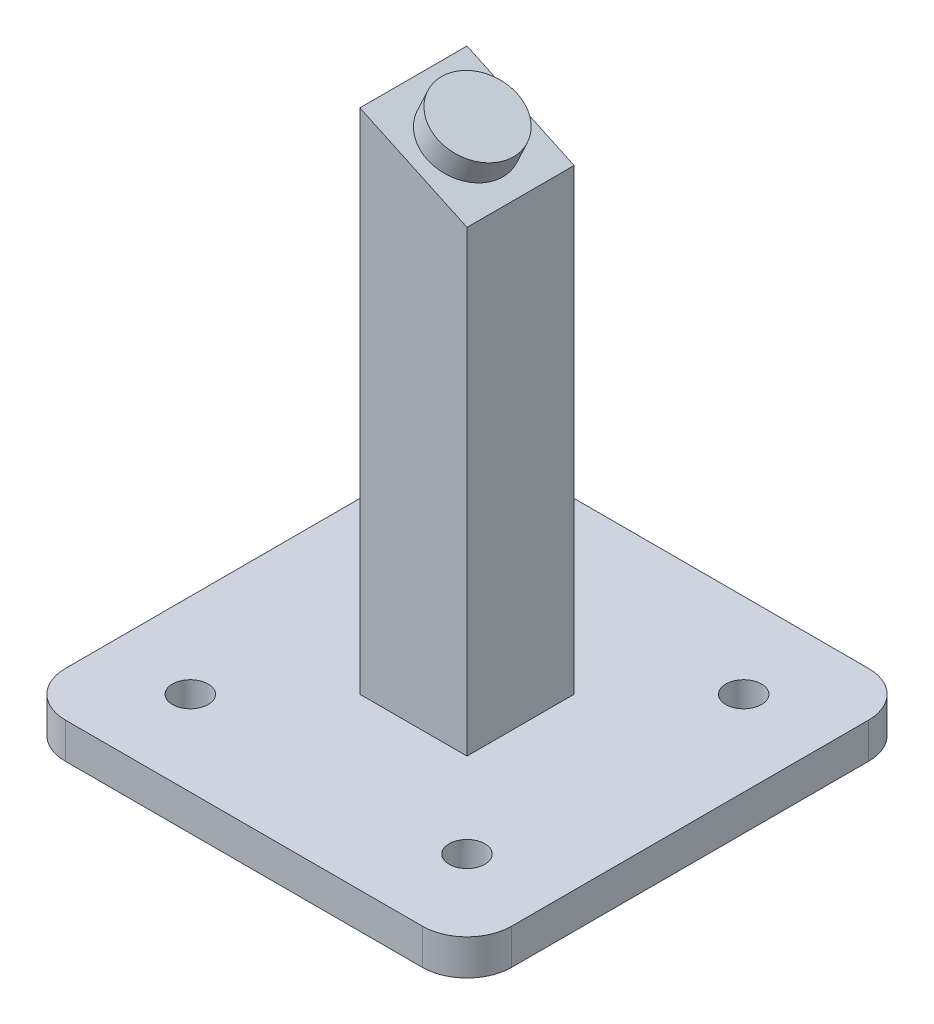
ISO-10303-21;
HEADER;
FILE_DESCRIPTION(('STEP AP214'),'2;1');
FILE_NAME('part.step','',(''),(''),'','','');
FILE_SCHEMA(('AUTOMOTIVE_DESIGN { 1 0 10303 214 1 1 1 1 }'));
ENDSEC;
DATA;
#1=APPLICATION_CONTEXT('core data for automotive mechanical design processes');
#2=APPLICATION_PROTOCOL_DEFINITION('international standard','automotive_design',2000,#1);
#3=PRODUCT_CONTEXT('',#1,'mechanical');
#4=PRODUCT('Part','Part','',(#3));
#5=PRODUCT_RELATED_PRODUCT_CATEGORY('part','',(#4));
#6=PRODUCT_DEFINITION_FORMATION('','',#4);
#7=PRODUCT_DEFINITION_CONTEXT('part definition',#1,'design');
#8=PRODUCT_DEFINITION('design','',#6,#7);
#9=PRODUCT_DEFINITION_SHAPE('','',#8);
#10=(LENGTH_UNIT() NAMED_UNIT(*) SI_UNIT(.MILLI.,.METRE.));
#11=(NAMED_UNIT(*) PLANE_ANGLE_UNIT() SI_UNIT($,.RADIAN.));
#12=(NAMED_UNIT(*) SI_UNIT($,.STERADIAN.) SOLID_ANGLE_UNIT());
#13=UNCERTAINTY_MEASURE_WITH_UNIT(LENGTH_MEASURE(1.E-05),#10,'distance_accuracy_value','');
#14=(GEOMETRIC_REPRESENTATION_CONTEXT(3) GLOBAL_UNCERTAINTY_ASSIGNED_CONTEXT((#13)) GLOBAL_UNIT_ASSIGNED_CONTEXT((#10,
#11,#12)) REPRESENTATION_CONTEXT('',''));
#15=CARTESIAN_POINT('',(0.,0.,0.));
#16=DIRECTION('',(0.,0.,1.));
#17=DIRECTION('',(1.,0.,0.));
#18=AXIS2_PLACEMENT_3D('',#15,#16,#17);
#19=CARTESIAN_POINT('',(45.,4.,-45.));
#20=DIRECTION('',(0.,-1.,0.));
#21=DIRECTION('',(0.,0.,-1.));
#22=AXIS2_PLACEMENT_3D('',#19,#20,#21);
#23=PLANE('',#22);
#24=CARTESIAN_POINT('',(40.5,4.,-9.5));
#25=DIRECTION('',(0.,1.,0.));
#26=DIRECTION('',(0.,0.,1.));
#27=AXIS2_PLACEMENT_3D('',#24,#25,#26);
#28=CIRCLE('',#27,2.);
#29=CARTESIAN_POINT('',(40.5,4.,-7.5));
#30=VERTEX_POINT('',#29);
#31=EDGE_CURVE('E195',#30,#30,#28,.T.);
#32=ORIENTED_EDGE('',*,*,#31,.F.);
#33=EDGE_LOOP('',(#32));
#34=FACE_BOUND('',#33,.T.);
#35=CARTESIAN_POINT('',(40.5,4.,-40.5));
#36=DIRECTION('',(0.,1.,0.));
#37=DIRECTION('',(0.,0.,1.));
#38=AXIS2_PLACEMENT_3D('',#35,#36,#37);
#39=CIRCLE('',#38,2.);
#40=CARTESIAN_POINT('',(40.5,4.,-38.5));
#41=VERTEX_POINT('',#40);
#42=EDGE_CURVE('E203',#41,#41,#39,.T.);
#43=ORIENTED_EDGE('',*,*,#42,.F.);
#44=EDGE_LOOP('',(#43));
#45=FACE_BOUND('',#44,.T.);
#46=CARTESIAN_POINT('',(9.50000000000001,4.,-40.5));
#47=DIRECTION('',(0.,1.,0.));
#48=DIRECTION('',(0.,0.,1.));
#49=AXIS2_PLACEMENT_3D('',#46,#47,#48);
#50=CIRCLE('',#49,2.);
#51=CARTESIAN_POINT('',(9.50000000000001,4.,-38.5));
#52=VERTEX_POINT('',#51);
#53=EDGE_CURVE('E211',#52,#52,#50,.T.);
#54=ORIENTED_EDGE('',*,*,#53,.F.);
#55=EDGE_LOOP('',(#54));
#56=FACE_BOUND('',#55,.T.);
#57=CARTESIAN_POINT('',(9.50000000000001,4.,-9.5));
#58=DIRECTION('',(0.,1.,0.));
#59=DIRECTION('',(0.,0.,1.));
#60=AXIS2_PLACEMENT_3D('',#57,#58,#59);
#61=CIRCLE('',#60,2.);
#62=CARTESIAN_POINT('',(9.50000000000001,4.,-7.5));
#63=VERTEX_POINT('',#62);
#64=EDGE_CURVE('E219',#63,#63,#61,.T.);
#65=ORIENTED_EDGE('',*,*,#64,.F.);
#66=EDGE_LOOP('',(#65));
#67=FACE_BOUND('',#66,.T.);
#68=CARTESIAN_POINT('',(45.,4.,-45.));
#69=DIRECTION('',(0.,1.,0.));
#70=DIRECTION('',(0.,0.,-1.));
#71=AXIS2_PLACEMENT_3D('',#68,#69,#70);
#72=CIRCLE('',#71,5.);
#73=CARTESIAN_POINT('',(50.,4.,-45.));
#74=VERTEX_POINT('',#73);
#75=CARTESIAN_POINT('',(45.,4.,-50.));
#76=VERTEX_POINT('',#75);
#77=EDGE_CURVE('E227',#74,#76,#72,.T.);
#78=ORIENTED_EDGE('',*,*,#77,.T.);
#79=DIRECTION('',(-1.,0.,0.));
#80=VECTOR('',#79,1.);
#81=CARTESIAN_POINT('',(5.00000000000004,4.,-50.));
#82=LINE('',#81,#80);
#83=CARTESIAN_POINT('',(5.00000000000004,4.,-50.));
#84=VERTEX_POINT('',#83);
#85=EDGE_CURVE('E231',#76,#84,#82,.T.);
#86=ORIENTED_EDGE('',*,*,#85,.T.);
#87=CARTESIAN_POINT('',(5.,4.,-45.));
#88=DIRECTION('',(0.,1.,0.));
#89=DIRECTION('',(0.,0.,-1.));
#90=AXIS2_PLACEMENT_3D('',#87,#88,#89);
#91=CIRCLE('',#90,5.);
#92=CARTESIAN_POINT('',(0.,4.,-45.));
#93=VERTEX_POINT('',#92);
#94=EDGE_CURVE('E235',#84,#93,#91,.T.);
#95=ORIENTED_EDGE('',*,*,#94,.T.);
#96=DIRECTION('',(0.,0.,1.));
#97=VECTOR('',#96,1.);
#98=CARTESIAN_POINT('',(0.,4.,-5.00000000000004));
#99=LINE('',#98,#97);
#100=CARTESIAN_POINT('',(0.,4.,-5.00000000000004));
#101=VERTEX_POINT('',#100);
#102=EDGE_CURVE('E238',#93,#101,#99,.T.);
#103=ORIENTED_EDGE('',*,*,#102,.T.);
#104=CARTESIAN_POINT('',(5.,4.,-5.));
#105=DIRECTION('',(0.,1.,0.));
#106=DIRECTION('',(0.,0.,-1.));
#107=AXIS2_PLACEMENT_3D('',#104,#105,#106);
#108=CIRCLE('',#107,5.);
#109=CARTESIAN_POINT('',(5.00000000000004,4.,0.));
#110=VERTEX_POINT('',#109);
#111=EDGE_CURVE('E241',#101,#110,#108,.T.);
#112=ORIENTED_EDGE('',*,*,#111,.T.);
#113=DIRECTION('',(1.,0.,0.));
#114=VECTOR('',#113,1.);
#115=CARTESIAN_POINT('',(5.00000000000004,4.,0.));
#116=LINE('',#115,#114);
#117=CARTESIAN_POINT('',(45.,4.,0.));
#118=VERTEX_POINT('',#117);
#119=EDGE_CURVE('E244',#110,#118,#116,.T.);
#120=ORIENTED_EDGE('',*,*,#119,.T.);
#121=CARTESIAN_POINT('',(45.,4.,-5.));
#122=DIRECTION('',(0.,1.,0.));
#123=DIRECTION('',(0.,0.,1.));
#124=AXIS2_PLACEMENT_3D('',#121,#122,#123);
#125=CIRCLE('',#124,5.);
#126=CARTESIAN_POINT('',(50.,4.,-5.00000000000003));
#127=VERTEX_POINT('',#126);
#128=EDGE_CURVE('E247',#118,#127,#125,.T.);
#129=ORIENTED_EDGE('',*,*,#128,.T.);
#130=DIRECTION('',(0.,0.,-1.));
#131=VECTOR('',#130,1.);
#132=CARTESIAN_POINT('',(50.,4.,-5.00000000000004));
#133=LINE('',#132,#131);
#134=EDGE_CURVE('E250',#127,#74,#133,.T.);
#135=ORIENTED_EDGE('',*,*,#134,.T.);
#136=EDGE_LOOP('',(#78,#86,#95,#103,#112,#120,#129,#135));
#137=FACE_BOUND('',#136,.T.);
#138=DIRECTION('',(0.,0.,1.));
#139=VECTOR('',#138,1.);
#140=CARTESIAN_POINT('',(19.,4.,-31.));
#141=LINE('',#140,#139);
#142=CARTESIAN_POINT('',(19.,4.,-31.));
#143=VERTEX_POINT('',#142);
#144=CARTESIAN_POINT('',(19.,4.,-19.));
#145=VERTEX_POINT('',#144);
#146=EDGE_CURVE('E142',#143,#145,#141,.T.);
#147=ORIENTED_EDGE('',*,*,#146,.F.);
#148=DIRECTION('',(-1.,0.,0.));
#149=VECTOR('',#148,1.);
#150=CARTESIAN_POINT('',(19.,4.,-31.));
#151=LINE('',#150,#149);
#152=CARTESIAN_POINT('',(31.,4.,-31.));
#153=VERTEX_POINT('',#152);
#154=EDGE_CURVE('E177',#153,#143,#151,.T.);
#155=ORIENTED_EDGE('',*,*,#154,.F.);
#156=DIRECTION('',(0.,0.,-1.));
#157=VECTOR('',#156,1.);
#158=CARTESIAN_POINT('',(31.,4.,-31.));
#159=LINE('',#158,#157);
#160=CARTESIAN_POINT('',(31.,4.,-19.));
#161=VERTEX_POINT('',#160);
#162=EDGE_CURVE('E69',#161,#153,#159,.T.);
#163=ORIENTED_EDGE('',*,*,#162,.F.);
#164=DIRECTION('',(1.,0.,0.));
#165=VECTOR('',#164,1.);
#166=CARTESIAN_POINT('',(19.,4.,-19.));
#167=LINE('',#166,#165);
#168=EDGE_CURVE('E64',#145,#161,#167,.T.);
#169=ORIENTED_EDGE('',*,*,#168,.F.);
#170=EDGE_LOOP('',(#147,#155,#163,#169));
#171=FACE_BOUND('',#170,.T.);
#172=ADVANCED_FACE('F47',(#34,#45,#56,#67,#137,#171),#23,.F.);
#173=CARTESIAN_POINT('',(45.,0.,-45.));
#174=DIRECTION('',(0.,-1.,0.));
#175=DIRECTION('',(0.,0.,-1.));
#176=AXIS2_PLACEMENT_3D('',#173,#174,#175);
#177=PLANE('',#176);
#178=CARTESIAN_POINT('',(40.5,0.,-40.5));
#179=DIRECTION('',(0.,1.,0.));
#180=DIRECTION('',(0.,0.,1.));
#181=AXIS2_PLACEMENT_3D('',#178,#179,#180);
#182=CIRCLE('',#181,2.);
#183=CARTESIAN_POINT('',(40.5,0.,-38.5));
#184=VERTEX_POINT('',#183);
#185=EDGE_CURVE('E199',#184,#184,#182,.T.);
#186=ORIENTED_EDGE('',*,*,#185,.T.);
#187=EDGE_LOOP('',(#186));
#188=FACE_BOUND('',#187,.T.);
#189=CARTESIAN_POINT('',(9.50000000000001,0.,-9.5));
#190=DIRECTION('',(0.,1.,0.));
#191=DIRECTION('',(0.,0.,1.));
#192=AXIS2_PLACEMENT_3D('',#189,#190,#191);
#193=CIRCLE('',#192,2.);
#194=CARTESIAN_POINT('',(9.50000000000001,0.,-7.5));
#195=VERTEX_POINT('',#194);
#196=EDGE_CURVE('E215',#195,#195,#193,.T.);
#197=ORIENTED_EDGE('',*,*,#196,.T.);
#198=EDGE_LOOP('',(#197));
#199=FACE_BOUND('',#198,.T.);
#200=CARTESIAN_POINT('',(45.,0.,-45.));
#201=DIRECTION('',(0.,1.,0.));
#202=DIRECTION('',(0.,0.,-1.));
#203=AXIS2_PLACEMENT_3D('',#200,#201,#202);
#204=CIRCLE('',#203,5.);
#205=CARTESIAN_POINT('',(50.,0.,-45.));
#206=VERTEX_POINT('',#205);
#207=CARTESIAN_POINT('',(45.,0.,-50.));
#208=VERTEX_POINT('',#207);
#209=EDGE_CURVE('E223',#206,#208,#204,.T.);
#210=ORIENTED_EDGE('',*,*,#209,.F.);
#211=DIRECTION('',(0.,0.,-1.));
#212=VECTOR('',#211,1.);
#213=CARTESIAN_POINT('',(50.,0.,-5.00000000000004));
#214=LINE('',#213,#212);
#215=CARTESIAN_POINT('',(50.,0.,-5.00000000000003));
#216=VERTEX_POINT('',#215);
#217=EDGE_CURVE('E232',#216,#206,#214,.T.);
#218=ORIENTED_EDGE('',*,*,#217,.F.);
#219=CARTESIAN_POINT('',(45.,0.,-5.));
#220=DIRECTION('',(0.,1.,0.));
#221=DIRECTION('',(0.,0.,1.));
#222=AXIS2_PLACEMENT_3D('',#219,#220,#221);
#223=CIRCLE('',#222,5.);
#224=CARTESIAN_POINT('',(45.,0.,0.));
#225=VERTEX_POINT('',#224);
#226=EDGE_CURVE('E271',#225,#216,#223,.T.);
#227=ORIENTED_EDGE('',*,*,#226,.F.);
#228=DIRECTION('',(1.,0.,0.));
#229=VECTOR('',#228,1.);
#230=CARTESIAN_POINT('',(5.00000000000004,0.,0.));
#231=LINE('',#230,#229);
#232=CARTESIAN_POINT('',(5.00000000000004,0.,0.));
#233=VERTEX_POINT('',#232);
#234=EDGE_CURVE('E268',#233,#225,#231,.T.);
#235=ORIENTED_EDGE('',*,*,#234,.F.);
#236=CARTESIAN_POINT('',(5.,0.,-5.));
#237=DIRECTION('',(0.,1.,0.));
#238=DIRECTION('',(0.,0.,-1.));
#239=AXIS2_PLACEMENT_3D('',#236,#237,#238);
#240=CIRCLE('',#239,5.);
#241=CARTESIAN_POINT('',(0.,0.,-5.00000000000004));
#242=VERTEX_POINT('',#241);
#243=EDGE_CURVE('E265',#242,#233,#240,.T.);
#244=ORIENTED_EDGE('',*,*,#243,.F.);
#245=DIRECTION('',(0.,0.,1.));
#246=VECTOR('',#245,1.);
#247=CARTESIAN_POINT('',(0.,0.,-5.00000000000004));
#248=LINE('',#247,#246);
#249=CARTESIAN_POINT('',(0.,0.,-45.));
#250=VERTEX_POINT('',#249);
#251=EDGE_CURVE('E262',#250,#242,#248,.T.);
#252=ORIENTED_EDGE('',*,*,#251,.F.);
#253=CARTESIAN_POINT('',(5.,0.,-45.));
#254=DIRECTION('',(0.,1.,0.));
#255=DIRECTION('',(0.,0.,-1.));
#256=AXIS2_PLACEMENT_3D('',#253,#254,#255);
#257=CIRCLE('',#256,5.);
#258=CARTESIAN_POINT('',(5.00000000000004,0.,-50.));
#259=VERTEX_POINT('',#258);
#260=EDGE_CURVE('E259',#259,#250,#257,.T.);
#261=ORIENTED_EDGE('',*,*,#260,.F.);
#262=DIRECTION('',(-1.,0.,0.));
#263=VECTOR('',#262,1.);
#264=CARTESIAN_POINT('',(5.00000000000004,0.,-50.));
#265=LINE('',#264,#263);
#266=EDGE_CURVE('E256',#208,#259,#265,.T.);
#267=ORIENTED_EDGE('',*,*,#266,.F.);
#268=EDGE_LOOP('',(#210,#218,#227,#235,#244,#252,#261,#267));
#269=FACE_BOUND('',#268,.T.);
#270=CARTESIAN_POINT('',(9.50000000000001,0.,-40.5));
#271=DIRECTION('',(0.,1.,0.));
#272=DIRECTION('',(0.,0.,1.));
#273=AXIS2_PLACEMENT_3D('',#270,#271,#272);
#274=CIRCLE('',#273,2.);
#275=CARTESIAN_POINT('',(9.50000000000001,0.,-38.5));
#276=VERTEX_POINT('',#275);
#277=EDGE_CURVE('E207',#276,#276,#274,.T.);
#278=ORIENTED_EDGE('',*,*,#277,.T.);
#279=EDGE_LOOP('',(#278));
#280=FACE_BOUND('',#279,.T.);
#281=CARTESIAN_POINT('',(40.5,0.,-9.5));
#282=DIRECTION('',(0.,1.,0.));
#283=DIRECTION('',(0.,0.,1.));
#284=AXIS2_PLACEMENT_3D('',#281,#282,#283);
#285=CIRCLE('',#284,2.);
#286=CARTESIAN_POINT('',(40.5,0.,-7.5));
#287=VERTEX_POINT('',#286);
#288=EDGE_CURVE('E146',#287,#287,#285,.T.);
#289=ORIENTED_EDGE('',*,*,#288,.T.);
#290=EDGE_LOOP('',(#289));
#291=FACE_BOUND('',#290,.T.);
#292=ADVANCED_FACE('F317',(#188,#199,#269,#280,#291),#177,.T.);
#293=CARTESIAN_POINT('',(45.,4.,-45.));
#294=DIRECTION('',(0.,-1.,0.));
#295=DIRECTION('',(0.,0.,-1.));
#296=AXIS2_PLACEMENT_3D('',#293,#294,#295);
#297=CYLINDRICAL_SURFACE('',#296,5.);
#298=ORIENTED_EDGE('',*,*,#209,.T.);
#299=DIRECTION('',(0.,-1.,0.));
#300=VECTOR('',#299,1.);
#301=CARTESIAN_POINT('',(45.,4.,-50.));
#302=LINE('',#301,#300);
#303=EDGE_CURVE('E51',#76,#208,#302,.T.);
#304=ORIENTED_EDGE('',*,*,#303,.F.);
#305=ORIENTED_EDGE('',*,*,#77,.F.);
#306=DIRECTION('',(0.,-1.,0.));
#307=VECTOR('',#306,1.);
#308=CARTESIAN_POINT('',(50.,4.,-45.));
#309=LINE('',#308,#307);
#310=EDGE_CURVE('E253',#74,#206,#309,.T.);
#311=ORIENTED_EDGE('',*,*,#310,.T.);
#312=EDGE_LOOP('',(#298,#304,#305,#311));
#313=FACE_BOUND('',#312,.T.);
#314=ADVANCED_FACE('F49',(#313),#297,.T.);
#315=CARTESIAN_POINT('',(5.00000000000004,4.,-50.));
#316=DIRECTION('',(0.,0.,1.));
#317=DIRECTION('',(1.,0.,0.));
#318=AXIS2_PLACEMENT_3D('',#315,#316,#317);
#319=PLANE('',#318);
#320=ORIENTED_EDGE('',*,*,#266,.T.);
#321=DIRECTION('',(0.,-1.,0.));
#322=VECTOR('',#321,1.);
#323=CARTESIAN_POINT('',(5.00000000000004,4.,-50.));
#324=LINE('',#323,#322);
#325=EDGE_CURVE('E297',#84,#259,#324,.T.);
#326=ORIENTED_EDGE('',*,*,#325,.F.);
#327=ORIENTED_EDGE('',*,*,#85,.F.);
#328=ORIENTED_EDGE('',*,*,#303,.T.);
#329=EDGE_LOOP('',(#320,#326,#327,#328));
#330=FACE_BOUND('',#329,.T.);
#331=ADVANCED_FACE('F310',(#330),#319,.F.);
#332=CARTESIAN_POINT('',(5.,4.,-45.));
#333=DIRECTION('',(0.,-1.,0.));
#334=DIRECTION('',(0.,0.,-1.));
#335=AXIS2_PLACEMENT_3D('',#332,#333,#334);
#336=CYLINDRICAL_SURFACE('',#335,5.);
#337=ORIENTED_EDGE('',*,*,#260,.T.);
#338=DIRECTION('',(0.,-1.,0.));
#339=VECTOR('',#338,1.);
#340=CARTESIAN_POINT('',(0.,4.,-45.));
#341=LINE('',#340,#339);
#342=EDGE_CURVE('E294',#93,#250,#341,.T.);
#343=ORIENTED_EDGE('',*,*,#342,.F.);
#344=ORIENTED_EDGE('',*,*,#94,.F.);
#345=ORIENTED_EDGE('',*,*,#325,.T.);
#346=EDGE_LOOP('',(#337,#343,#344,#345));
#347=FACE_BOUND('',#346,.T.);
#348=ADVANCED_FACE('F323',(#347),#336,.T.);
#349=CARTESIAN_POINT('',(0.,4.,-5.00000000000004));
#350=DIRECTION('',(1.,0.,0.));
#351=DIRECTION('',(0.,0.,-1.));
#352=AXIS2_PLACEMENT_3D('',#349,#350,#351);
#353=PLANE('',#352);
#354=ORIENTED_EDGE('',*,*,#251,.T.);
#355=DIRECTION('',(0.,-1.,0.));
#356=VECTOR('',#355,1.);
#357=CARTESIAN_POINT('',(0.,4.,-5.00000000000004));
#358=LINE('',#357,#356);
#359=EDGE_CURVE('E290',#101,#242,#358,.T.);
#360=ORIENTED_EDGE('',*,*,#359,.F.);
#361=ORIENTED_EDGE('',*,*,#102,.F.);
#362=ORIENTED_EDGE('',*,*,#342,.T.);
#363=EDGE_LOOP('',(#354,#360,#361,#362));
#364=FACE_BOUND('',#363,.T.);
#365=ADVANCED_FACE('F326',(#364),#353,.F.);
#366=CARTESIAN_POINT('',(5.,4.,-5.));
#367=DIRECTION('',(0.,-1.,0.));
#368=DIRECTION('',(0.,0.,-1.));
#369=AXIS2_PLACEMENT_3D('',#366,#367,#368);
#370=CYLINDRICAL_SURFACE('',#369,5.);
#371=ORIENTED_EDGE('',*,*,#243,.T.);
#372=DIRECTION('',(0.,-1.,0.));
#373=VECTOR('',#372,1.);
#374=CARTESIAN_POINT('',(5.00000000000004,4.,0.));
#375=LINE('',#374,#373);
#376=EDGE_CURVE('E286',#110,#233,#375,.T.);
#377=ORIENTED_EDGE('',*,*,#376,.F.);
#378=ORIENTED_EDGE('',*,*,#111,.F.);
#379=ORIENTED_EDGE('',*,*,#359,.T.);
#380=EDGE_LOOP('',(#371,#377,#378,#379));
#381=FACE_BOUND('',#380,.T.);
#382=ADVANCED_FACE('F344',(#381),#370,.T.);
#383=CARTESIAN_POINT('',(5.00000000000004,4.,0.));
#384=DIRECTION('',(0.,0.,-1.));
#385=DIRECTION('',(-1.,0.,0.));
#386=AXIS2_PLACEMENT_3D('',#383,#384,#385);
#387=PLANE('',#386);
#388=ORIENTED_EDGE('',*,*,#234,.T.);
#389=DIRECTION('',(0.,-1.,0.));
#390=VECTOR('',#389,1.);
#391=CARTESIAN_POINT('',(45.,4.,0.));
#392=LINE('',#391,#390);
#393=EDGE_CURVE('E282',#118,#225,#392,.T.);
#394=ORIENTED_EDGE('',*,*,#393,.F.);
#395=ORIENTED_EDGE('',*,*,#119,.F.);
#396=ORIENTED_EDGE('',*,*,#376,.T.);
#397=EDGE_LOOP('',(#388,#394,#395,#396));
#398=FACE_BOUND('',#397,.T.);
#399=ADVANCED_FACE('F341',(#398),#387,.F.);
#400=CARTESIAN_POINT('',(45.,4.,-5.));
#401=DIRECTION('',(0.,-1.,0.));
#402=DIRECTION('',(0.,0.,-1.));
#403=AXIS2_PLACEMENT_3D('',#400,#401,#402);
#404=CYLINDRICAL_SURFACE('',#403,5.);
#405=ORIENTED_EDGE('',*,*,#226,.T.);
#406=DIRECTION('',(0.,-1.,0.));
#407=VECTOR('',#406,1.);
#408=CARTESIAN_POINT('',(50.,4.,-5.00000000000003));
#409=LINE('',#408,#407);
#410=EDGE_CURVE('E278',#127,#216,#409,.T.);
#411=ORIENTED_EDGE('',*,*,#410,.F.);
#412=ORIENTED_EDGE('',*,*,#128,.F.);
#413=ORIENTED_EDGE('',*,*,#393,.T.);
#414=EDGE_LOOP('',(#405,#411,#412,#413));
#415=FACE_BOUND('',#414,.T.);
#416=ADVANCED_FACE('F337',(#415),#404,.T.);
#417=CARTESIAN_POINT('',(50.,4.,-5.00000000000004));
#418=DIRECTION('',(-1.,0.,0.));
#419=DIRECTION('',(0.,0.,1.));
#420=AXIS2_PLACEMENT_3D('',#417,#418,#419);
#421=PLANE('',#420);
#422=ORIENTED_EDGE('',*,*,#217,.T.);
#423=ORIENTED_EDGE('',*,*,#310,.F.);
#424=ORIENTED_EDGE('',*,*,#134,.F.);
#425=ORIENTED_EDGE('',*,*,#410,.T.);
#426=EDGE_LOOP('',(#422,#423,#424,#425));
#427=FACE_BOUND('',#426,.T.);
#428=ADVANCED_FACE('F335',(#427),#421,.F.);
#429=CARTESIAN_POINT('',(9.50000000000001,4.,-9.5));
#430=DIRECTION('',(0.,-1.,0.));
#431=DIRECTION('',(0.,0.,-1.));
#432=AXIS2_PLACEMENT_3D('',#429,#430,#431);
#433=CYLINDRICAL_SURFACE('',#432,2.);
#434=ORIENTED_EDGE('',*,*,#64,.T.);
#435=EDGE_LOOP('',(#434));
#436=FACE_BOUND('',#435,.T.);
#437=ORIENTED_EDGE('',*,*,#196,.F.);
#438=EDGE_LOOP('',(#437));
#439=FACE_BOUND('',#438,.T.);
#440=ADVANCED_FACE('F364',(#436,#439),#433,.F.);
#441=CARTESIAN_POINT('',(9.50000000000001,4.,-40.5));
#442=DIRECTION('',(0.,-1.,0.));
#443=DIRECTION('',(0.,0.,-1.));
#444=AXIS2_PLACEMENT_3D('',#441,#442,#443);
#445=CYLINDRICAL_SURFACE('',#444,2.);
#446=ORIENTED_EDGE('',*,*,#53,.T.);
#447=EDGE_LOOP('',(#446));
#448=FACE_BOUND('',#447,.T.);
#449=ORIENTED_EDGE('',*,*,#277,.F.);
#450=EDGE_LOOP('',(#449));
#451=FACE_BOUND('',#450,.T.);
#452=ADVANCED_FACE('F382',(#448,#451),#445,.F.);
#453=CARTESIAN_POINT('',(40.5,4.,-40.5));
#454=DIRECTION('',(0.,-1.,0.));
#455=DIRECTION('',(0.,0.,-1.));
#456=AXIS2_PLACEMENT_3D('',#453,#454,#455);
#457=CYLINDRICAL_SURFACE('',#456,2.);
#458=ORIENTED_EDGE('',*,*,#42,.T.);
#459=EDGE_LOOP('',(#458));
#460=FACE_BOUND('',#459,.T.);
#461=ORIENTED_EDGE('',*,*,#185,.F.);
#462=EDGE_LOOP('',(#461));
#463=FACE_BOUND('',#462,.T.);
#464=ADVANCED_FACE('F388',(#460,#463),#457,.F.);
#465=CARTESIAN_POINT('',(40.5,4.,-9.5));
#466=DIRECTION('',(0.,-1.,0.));
#467=DIRECTION('',(0.,0.,-1.));
#468=AXIS2_PLACEMENT_3D('',#465,#466,#467);
#469=CYLINDRICAL_SURFACE('',#468,2.);
#470=ORIENTED_EDGE('',*,*,#31,.T.);
#471=EDGE_LOOP('',(#470));
#472=FACE_BOUND('',#471,.T.);
#473=ORIENTED_EDGE('',*,*,#288,.F.);
#474=EDGE_LOOP('',(#473));
#475=FACE_BOUND('',#474,.T.);
#476=ADVANCED_FACE('F394',(#472,#475),#469,.F.);
#477=CARTESIAN_POINT('',(19.,55.3,-31.));
#478=DIRECTION('',(1.,0.,0.));
#479=DIRECTION('',(0.,0.,-1.));
#480=AXIS2_PLACEMENT_3D('',#477,#478,#479);
#481=PLANE('',#480);
#482=ORIENTED_EDGE('',*,*,#146,.T.);
#483=DIRECTION('',(0.,-1.,0.));
#484=VECTOR('',#483,1.);
#485=CARTESIAN_POINT('',(19.,55.3,-19.));
#486=LINE('',#485,#484);
#487=CARTESIAN_POINT('',(19.,60.8956918978599,-19.));
#488=VERTEX_POINT('',#487);
#489=EDGE_CURVE('E136',#488,#145,#486,.T.);
#490=ORIENTED_EDGE('',*,*,#489,.F.);
#491=DIRECTION('',(0.,0.,1.));
#492=VECTOR('',#491,1.);
#493=CARTESIAN_POINT('',(19.,60.8956918978599,-44.2405350275499));
#494=LINE('',#493,#492);
#495=CARTESIAN_POINT('',(19.,60.8956918978599,-31.));
#496=VERTEX_POINT('',#495);
#497=EDGE_CURVE('E140',#496,#488,#494,.T.);
#498=ORIENTED_EDGE('',*,*,#497,.F.);
#499=DIRECTION('',(0.,-1.,0.));
#500=VECTOR('',#499,1.);
#501=CARTESIAN_POINT('',(19.,55.3,-31.));
#502=LINE('',#501,#500);
#503=EDGE_CURVE('E176',#496,#143,#502,.T.);
#504=ORIENTED_EDGE('',*,*,#503,.T.);
#505=EDGE_LOOP('',(#482,#490,#498,#504));
#506=FACE_BOUND('',#505,.T.);
#507=ADVANCED_FACE('F138',(#506),#481,.F.);
#508=CARTESIAN_POINT('',(19.,55.3,-19.));
#509=DIRECTION('',(0.,0.,-1.));
#510=DIRECTION('',(-1.,0.,0.));
#511=AXIS2_PLACEMENT_3D('',#508,#509,#510);
#512=PLANE('',#511);
#513=ORIENTED_EDGE('',*,*,#168,.T.);
#514=DIRECTION('',(0.,-1.,0.));
#515=VECTOR('',#514,1.);
#516=CARTESIAN_POINT('',(31.,55.3,-19.));
#517=LINE('',#516,#515);
#518=CARTESIAN_POINT('',(31.,55.3,-19.));
#519=VERTEX_POINT('',#518);
#520=EDGE_CURVE('E147',#519,#161,#517,.T.);
#521=ORIENTED_EDGE('',*,*,#520,.F.);
#522=DIRECTION('',(-0.906307787036653,0.422618261740693,0.));
#523=VECTOR('',#522,1.);
#524=CARTESIAN_POINT('',(31.,55.3,-19.));
#525=LINE('',#524,#523);
#526=EDGE_CURVE('E153',#519,#488,#525,.T.);
#527=ORIENTED_EDGE('',*,*,#526,.T.);
#528=ORIENTED_EDGE('',*,*,#489,.T.);
#529=EDGE_LOOP('',(#513,#521,#527,#528));
#530=FACE_BOUND('',#529,.T.);
#531=ADVANCED_FACE('F158',(#530),#512,.F.);
#532=CARTESIAN_POINT('',(31.,55.3,-31.));
#533=DIRECTION('',(-1.,0.,0.));
#534=DIRECTION('',(0.,0.,1.));
#535=AXIS2_PLACEMENT_3D('',#532,#533,#534);
#536=PLANE('',#535);
#537=ORIENTED_EDGE('',*,*,#162,.T.);
#538=DIRECTION('',(0.,-1.,0.));
#539=VECTOR('',#538,1.);
#540=CARTESIAN_POINT('',(31.,55.3,-31.));
#541=LINE('',#540,#539);
#542=CARTESIAN_POINT('',(31.,55.3,-31.));
#543=VERTEX_POINT('',#542);
#544=EDGE_CURVE('E189',#543,#153,#541,.T.);
#545=ORIENTED_EDGE('',*,*,#544,.F.);
#546=DIRECTION('',(0.,0.,-1.));
#547=VECTOR('',#546,1.);
#548=CARTESIAN_POINT('',(31.,55.3,-31.));
#549=LINE('',#548,#547);
#550=EDGE_CURVE('E173',#519,#543,#549,.T.);
#551=ORIENTED_EDGE('',*,*,#550,.F.);
#552=ORIENTED_EDGE('',*,*,#520,.T.);
#553=EDGE_LOOP('',(#537,#545,#551,#552));
#554=FACE_BOUND('',#553,.T.);
#555=ADVANCED_FACE('F412',(#554),#536,.F.);
#556=CARTESIAN_POINT('',(19.,55.3,-31.));
#557=DIRECTION('',(0.,0.,1.));
#558=DIRECTION('',(1.,0.,0.));
#559=AXIS2_PLACEMENT_3D('',#556,#557,#558);
#560=PLANE('',#559);
#561=ORIENTED_EDGE('',*,*,#154,.T.);
#562=ORIENTED_EDGE('',*,*,#503,.F.);
#563=DIRECTION('',(0.906307787036653,-0.422618261740693,0.));
#564=VECTOR('',#563,1.);
#565=CARTESIAN_POINT('',(31.,55.3,-31.));
#566=LINE('',#565,#564);
#567=EDGE_CURVE('E155',#496,#543,#566,.T.);
#568=ORIENTED_EDGE('',*,*,#567,.T.);
#569=ORIENTED_EDGE('',*,*,#544,.T.);
#570=EDGE_LOOP('',(#561,#562,#568,#569));
#571=FACE_BOUND('',#570,.T.);
#572=ADVANCED_FACE('F418',(#571),#560,.F.);
#573=CARTESIAN_POINT('',(31.,55.3,-44.2405350275499));
#574=DIRECTION('',(0.422618261740693,0.906307787036653,0.));
#575=DIRECTION('',(-0.906307787036653,0.422618261740693,0.));
#576=AXIS2_PLACEMENT_3D('',#573,#574,#575);
#577=PLANE('',#576);
#578=CARTESIAN_POINT('',(25.,58.0978459489299,-25.));
#579=DIRECTION('',(0.422618261740694,0.906307787036653,0.));
#580=DIRECTION('',(-0.906307787036653,0.422618261740693,0.));
#581=AXIS2_PLACEMENT_3D('',#578,#579,#580);
#582=CIRCLE('',#581,4.45000000000001);
#583=CARTESIAN_POINT('',(20.9669303476869,59.978497213676,-25.));
#584=VERTEX_POINT('',#583);
#585=EDGE_CURVE('E11',#584,#584,#582,.T.);
#586=ORIENTED_EDGE('',*,*,#585,.F.);
#587=EDGE_LOOP('',(#586));
#588=FACE_BOUND('',#587,.T.);
#589=ORIENTED_EDGE('',*,*,#567,.F.);
#590=ORIENTED_EDGE('',*,*,#497,.T.);
#591=ORIENTED_EDGE('',*,*,#526,.F.);
#592=ORIENTED_EDGE('',*,*,#550,.T.);
#593=EDGE_LOOP('',(#589,#590,#591,#592));
#594=FACE_BOUND('',#593,.T.);
#595=ADVANCED_FACE('F151',(#588,#594),#577,.T.);
#596=CARTESIAN_POINT('',(26.1833311328739,60.6355077526326,-25.));
#597=DIRECTION('',(-0.422618261740693,-0.906307787036653,0.));
#598=DIRECTION('',(0.906307787036653,-0.422618261740693,0.));
#599=AXIS2_PLACEMENT_3D('',#596,#597,#598);
#600=CYLINDRICAL_SURFACE('',#599,4.45000000000001);
#601=CARTESIAN_POINT('',(26.1833311328739,60.6355077526326,-25.));
#602=DIRECTION('',(0.422618261740694,0.906307787036653,0.));
#603=DIRECTION('',(-0.906307787036653,0.422618261740693,0.));
#604=AXIS2_PLACEMENT_3D('',#601,#602,#603);
#605=CIRCLE('',#604,4.45000000000001);
#606=CARTESIAN_POINT('',(22.1502614805608,62.5161590173787,-25.));
#607=VERTEX_POINT('',#606);
#608=EDGE_CURVE('E162',#607,#607,#605,.T.);
#609=ORIENTED_EDGE('',*,*,#608,.F.);
#610=EDGE_LOOP('',(#609));
#611=FACE_BOUND('',#610,.T.);
#612=ORIENTED_EDGE('',*,*,#585,.T.);
#613=EDGE_LOOP('',(#612));
#614=FACE_BOUND('',#613,.T.);
#615=ADVANCED_FACE('F431',(#611,#614),#600,.T.);
#616=CARTESIAN_POINT('',(26.1833311328739,60.6355077526326,-25.));
#617=DIRECTION('',(0.422618261740694,0.906307787036653,0.));
#618=DIRECTION('',(-0.906307787036653,0.422618261740693,0.));
#619=AXIS2_PLACEMENT_3D('',#616,#617,#618);
#620=PLANE('',#619);
#621=ORIENTED_EDGE('',*,*,#608,.T.);
#622=EDGE_LOOP('',(#621));
#623=FACE_BOUND('',#622,.T.);
#624=ADVANCED_FACE('F438',(#623),#620,.T.);
#625=CLOSED_SHELL('',(#172,#292,#314,#331,#348,#365,#382,#399,#416,#428,#440,#452,#464,#476,
#507,#531,#555,#572,#595,#615,#624));
#626=MANIFOLD_SOLID_BREP('B2',#625);
#627=ADVANCED_BREP_SHAPE_REPRESENTATION('',(#18,#626),#14);
#628=SHAPE_DEFINITION_REPRESENTATION(#9,#627);
ENDSEC;
END-ISO-10303-21;
